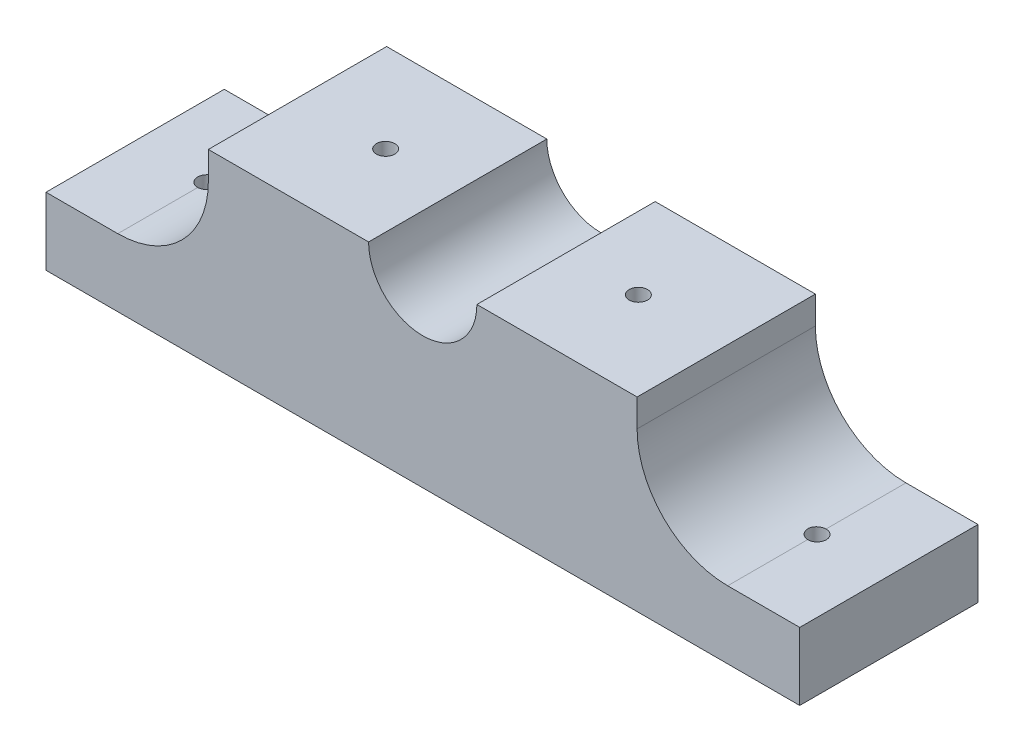
ISO-10303-21;
HEADER;
FILE_DESCRIPTION(('STEP AP214'),'2;1');
FILE_NAME('part.step','',(''),(''),'','','');
FILE_SCHEMA(('AUTOMOTIVE_DESIGN { 1 0 10303 214 1 1 1 1 }'));
ENDSEC;
DATA;
#1=APPLICATION_CONTEXT('core data for automotive mechanical design processes');
#2=APPLICATION_PROTOCOL_DEFINITION('international standard','automotive_design',2000,#1);
#3=PRODUCT_CONTEXT('',#1,'mechanical');
#4=PRODUCT('Part','Part','',(#3));
#5=PRODUCT_RELATED_PRODUCT_CATEGORY('part','',(#4));
#6=PRODUCT_DEFINITION_FORMATION('','',#4);
#7=PRODUCT_DEFINITION_CONTEXT('part definition',#1,'design');
#8=PRODUCT_DEFINITION('design','',#6,#7);
#9=PRODUCT_DEFINITION_SHAPE('','',#8);
#10=(LENGTH_UNIT() NAMED_UNIT(*) SI_UNIT(.MILLI.,.METRE.));
#11=(NAMED_UNIT(*) PLANE_ANGLE_UNIT() SI_UNIT($,.RADIAN.));
#12=(NAMED_UNIT(*) SI_UNIT($,.STERADIAN.) SOLID_ANGLE_UNIT());
#13=UNCERTAINTY_MEASURE_WITH_UNIT(LENGTH_MEASURE(1.E-05),#10,'distance_accuracy_value','');
#14=(GEOMETRIC_REPRESENTATION_CONTEXT(3) GLOBAL_UNCERTAINTY_ASSIGNED_CONTEXT((#13)) GLOBAL_UNIT_ASSIGNED_CONTEXT((#10,
#11,#12)) REPRESENTATION_CONTEXT('',''));
#15=CARTESIAN_POINT('',(0.,0.,0.));
#16=DIRECTION('',(0.,0.,1.));
#17=DIRECTION('',(1.,0.,0.));
#18=AXIS2_PLACEMENT_3D('',#15,#16,#17);
#19=CARTESIAN_POINT('',(16.8821651532389,8.762500128,4.936500033));
#20=DIRECTION('',(0.,0.,1.));
#21=DIRECTION('',(1.,0.,0.));
#22=AXIS2_PLACEMENT_3D('',#19,#20,#21);
#23=CYLINDRICAL_SURFACE('',#22,5.0165);
#24=CARTESIAN_POINT('',(16.8968348527611,3.74602157727182,-0.508000000000002));
#25=CARTESIAN_POINT('',(16.8683835995085,3.74593870795814,-0.507998769979204));
#26=CARTESIAN_POINT('',(16.8399128999517,3.74609973687703,-0.505601778276698));
#27=CARTESIAN_POINT('',(16.783759490476,3.74688654606868,-0.49607527330449));
#28=CARTESIAN_POINT('',(16.7560776786133,3.74751283563572,-0.488940574846726));
#29=CARTESIAN_POINT('',(16.7023233890728,3.74915274800012,-0.470148024369588));
#30=CARTESIAN_POINT('',(16.6762499586369,3.75016613888046,-0.45849288053891));
#31=CARTESIAN_POINT('',(16.6264346056154,3.75246053555959,-0.430995506692803));
#32=CARTESIAN_POINT('',(16.6026922241687,3.75374148853356,-0.415154103007707));
#33=CARTESIAN_POINT('',(16.5581226474811,3.75642686022117,-0.379673404731885));
#34=CARTESIAN_POINT('',(16.5373049258928,3.75783165722054,-0.360022237339966));
#35=CARTESIAN_POINT('',(16.4992567502414,3.76059866589861,-0.317505202576717));
#36=CARTESIAN_POINT('',(16.4820264638949,3.76196087558378,-0.294639184991432));
#37=CARTESIAN_POINT('',(16.4516055167601,3.76448802050699,-0.246277736405523));
#38=CARTESIAN_POINT('',(16.4384241664088,3.76565249835814,-0.220776422758243));
#39=CARTESIAN_POINT('',(16.4165339184629,3.76764464137813,-0.167909174167944));
#40=CARTESIAN_POINT('',(16.4078249154476,3.76847231448592,-0.140543283193378));
#41=CARTESIAN_POINT('',(16.3951534510169,3.76969203392459,-0.0848157170487618));
#42=CARTESIAN_POINT('',(16.3911760109098,3.77008545467971,-0.056457478415006));
#43=CARTESIAN_POINT('',(16.3880343638308,3.77039539767983,0.000526572896369434));
#44=CARTESIAN_POINT('',(16.3888700334707,3.77031193215021,0.0291523786958964));
#45=CARTESIAN_POINT('',(16.3953181438809,3.76967903948762,0.0857521651965404));
#46=CARTESIAN_POINT('',(16.4009136635174,3.76913126299168,0.11372809471511));
#47=CARTESIAN_POINT('',(16.41669634307,3.76763543171349,0.168341868443256));
#48=CARTESIAN_POINT('',(16.4268835650171,3.76668737152369,0.194979694570531));
#49=CARTESIAN_POINT('',(16.4515792774824,3.76449840580836,0.24621459415436));
#50=CARTESIAN_POINT('',(16.466095283286,3.76325699177004,0.270808022550724));
#51=CARTESIAN_POINT('',(16.4990312932673,3.76062520679627,0.317216027502702));
#52=CARTESIAN_POINT('',(16.5174514086494,3.75923483161837,0.339030524875074));
#53=CARTESIAN_POINT('',(16.5577663831488,3.75645910769828,0.379358549415782));
#54=CARTESIAN_POINT('',(16.5796756906958,3.75507380550056,0.39785763927004));
#55=CARTESIAN_POINT('',(16.626297031141,3.75247538707805,0.430917514415933));
#56=CARTESIAN_POINT('',(16.6510090633219,3.7512622708092,0.445478300715511));
#57=CARTESIAN_POINT('',(16.702539324891,3.74915085076711,0.470245034168563));
#58=CARTESIAN_POINT('',(16.72935751907,3.74825254173255,0.480451054103323));
#59=CARTESIAN_POINT('',(16.7843377096661,3.74687876906453,0.496211780426468));
#60=CARTESIAN_POINT('',(16.8124996650633,3.74640329253232,0.501766628701178));
#61=CARTESIAN_POINT('',(16.8692367550418,3.74593693401639,0.508048678622856));
#62=CARTESIAN_POINT('',(16.8978095621675,3.74594395506502,0.508796755312923));
#63=CARTESIAN_POINT('',(16.9546725937421,3.74644356788062,0.505499599644446));
#64=CARTESIAN_POINT('',(16.9829628216772,3.74693615364964,0.501454426494619));
#65=CARTESIAN_POINT('',(17.0384043979041,3.74835717611454,0.48870204839272));
#66=CARTESIAN_POINT('',(17.0655577720878,3.74928479811608,0.480003553472104));
#67=CARTESIAN_POINT('',(17.1180194446348,3.75147877729557,0.458201185757061));
#68=CARTESIAN_POINT('',(17.1433276979362,3.75274514274284,0.445097205414931));
#69=CARTESIAN_POINT('',(17.1914822869587,3.75548707409465,0.414800002874336));
#70=CARTESIAN_POINT('',(17.2143192821744,3.75696338801938,0.397592003363164));
#71=CARTESIAN_POINT('',(17.2567879898025,3.75996236178625,0.359596443166546));
#72=CARTESIAN_POINT('',(17.2764196191261,3.76148502282857,0.338808789718832));
#73=CARTESIAN_POINT('',(17.3119933917473,3.76441643840524,0.294151785084833));
#74=CARTESIAN_POINT('',(17.3279217187912,3.7658247540214,0.270271395326607));
#75=CARTESIAN_POINT('',(17.3555412639642,3.76836551858372,0.220160989199365));
#76=CARTESIAN_POINT('',(17.367232547566,3.76949797179253,0.193931009144987));
#77=CARTESIAN_POINT('',(17.3860199809078,3.77135876377348,0.139920468958283));
#78=CARTESIAN_POINT('',(17.3931255173129,3.77208792760676,0.112143203498635));
#79=CARTESIAN_POINT('',(17.4025707222305,3.77306396713842,0.0557818545515448));
#80=CARTESIAN_POINT('',(17.4049105391815,3.77331085785822,0.0271977962215146));
#81=CARTESIAN_POINT('',(17.4047557911068,3.77329465761081,-0.0298201447762072));
#82=CARTESIAN_POINT('',(17.4022842340411,3.7730339937649,-0.058254093381145));
#83=CARTESIAN_POINT('',(17.3926251681188,3.77203661675151,-0.114300448364218));
#84=CARTESIAN_POINT('',(17.3854376553487,3.77129990318898,-0.141912854060572));
#85=CARTESIAN_POINT('',(17.3665571482628,3.76943233550989,-0.19553196569449));
#86=CARTESIAN_POINT('',(17.3548648511422,3.76830154238672,-0.22153891938192));
#87=CARTESIAN_POINT('',(17.3273091704034,3.76577023243768,-0.271224797228588));
#88=CARTESIAN_POINT('',(17.3114458014165,3.76436971655795,-0.294903729553716));
#89=CARTESIAN_POINT('',(17.2759121792001,3.76144485029233,-0.339379282348455));
#90=CARTESIAN_POINT('',(17.2562247885962,3.75991996107327,-0.360162175840875));
#91=CARTESIAN_POINT('',(17.2136364687143,3.75691787233579,-0.398139205724773));
#92=CARTESIAN_POINT('',(17.1907347663012,3.75544068439635,-0.415332476225729));
#93=CARTESIAN_POINT('',(17.1422963473192,3.752690380373,-0.445681623375823));
#94=CARTESIAN_POINT('',(17.1167523465453,3.75141785453617,-0.4588259191185));
#95=CARTESIAN_POINT('',(17.0638229420305,3.74922062020477,-0.480620765269378));
#96=CARTESIAN_POINT('',(17.0364396486881,3.74829552084712,-0.489276369764739));
#97=CARTESIAN_POINT('',(16.9902243857495,3.74713046252969,-0.499695529107196));
#98=CARTESIAN_POINT('',(16.9716879812062,3.74676430311436,-0.502805386081911));
#99=CARTESIAN_POINT('',(16.9343821583255,3.74623720788274,-0.506958023056359));
#100=CARTESIAN_POINT('',(16.9156127409759,3.74607627119671,-0.508000811816369));
#101=CARTESIAN_POINT('',(16.8968348527611,3.74602157727182,-0.508000000000002));
#102=B_SPLINE_CURVE_WITH_KNOTS('',3,(#24,#25,#26,#27,#28,#29,#30,#31,#32,#33,#34,#35,#36,#37,
#38,#39,#40,#41,#42,#43,#44,#45,#46,#47,#48,#49,#50,#51,#52,#53,#54,#55,#56,#57,#58,#59,#60,#61,
#62,#63,#64,#65,#66,#67,#68,#69,#70,#71,#72,#73,#74,#75,#76,#77,#78,#79,#80,#81,#82,#83,#84,#85,
#86,#87,#88,#89,#90,#91,#92,#93,#94,#95,#96,#97,#98,#99,#100,#101),.UNSPECIFIED.,.T.,.F.,(4,2,2,
2,2,2,2,2,2,2,2,2,2,2,2,2,2,2,2,2,2,2,2,2,2,2,2,2,2,2,2,2,2,2,2,2,2,2,4),(0.,0.0852855718549176,
0.170664638774131,0.255992634099702,0.341303799005254,0.426885231311988,0.512470663743069,
0.59825144960307,0.68403021337261,0.769536698790279,0.855040992186797,0.940242584440914,
1.02544532774718,1.11079686300209,1.19615082973159,1.28186789763181,1.36758494359418,
1.45330055690996,1.53901355533268,1.62435406283229,1.70969351617251,1.7948737882209,
1.8800561398603,1.96554996503408,2.05104600600722,2.13685607221388,2.22266481239192,
2.3082973469985,2.39392721435517,2.47914860596874,2.56437006830381,2.64957834640188,
2.73478632560828,2.82038536258805,2.90600502401143,2.99186734902295,3.07763278542165,
3.13392168445753,3.19021034493943),.UNSPECIFIED.);
#103=CARTESIAN_POINT('',(16.8821651532389,3.746000128,-0.507788144717784));
#104=VERTEX_POINT('',#103);
#105=CARTESIAN_POINT('',(16.8821651532389,3.74600012799998,0.507788144717992));
#106=VERTEX_POINT('',#105);
#107=EDGE_CURVE('E11',#104,#106,#102,.T.);
#108=ORIENTED_EDGE('',*,*,#107,.F.);
#109=DIRECTION('',(0.,0.,-1.));
#110=VECTOR('',#109,1.);
#111=CARTESIAN_POINT('',(16.8821651532389,3.746000128,4.936500033));
#112=LINE('',#111,#110);
#113=CARTESIAN_POINT('',(16.8821651532389,3.746000128,-4.936500033));
#114=VERTEX_POINT('',#113);
#115=EDGE_CURVE('E173',#114,#104,#112,.F.);
#116=ORIENTED_EDGE('',*,*,#115,.F.);
#117=CARTESIAN_POINT('',(16.8821651532389,8.762500128,-4.936500033));
#118=DIRECTION('',(0.,0.,-1.));
#119=DIRECTION('',(-1.,0.,0.));
#120=AXIS2_PLACEMENT_3D('',#117,#118,#119);
#121=CIRCLE('',#120,5.0165);
#122=CARTESIAN_POINT('',(11.8656651532389,8.762500128,-4.936500033));
#123=VERTEX_POINT('',#122);
#124=EDGE_CURVE('E171',#123,#114,#121,.F.);
#125=ORIENTED_EDGE('',*,*,#124,.F.);
#126=DIRECTION('',(0.,0.,-1.));
#127=VECTOR('',#126,1.);
#128=CARTESIAN_POINT('',(11.8656651532389,8.762500128,-4.936500033));
#129=LINE('',#128,#127);
#130=CARTESIAN_POINT('',(11.8656651532389,8.762500128,4.936500033));
#131=VERTEX_POINT('',#130);
#132=EDGE_CURVE('E267',#131,#123,#129,.T.);
#133=ORIENTED_EDGE('',*,*,#132,.F.);
#134=CARTESIAN_POINT('',(16.8821651532389,8.762500128,4.936500033));
#135=DIRECTION('',(0.,0.,-1.));
#136=DIRECTION('',(-1.,0.,0.));
#137=AXIS2_PLACEMENT_3D('',#134,#135,#136);
#138=CIRCLE('',#137,5.0165);
#139=CARTESIAN_POINT('',(16.8821651532389,3.746000128,4.936500033));
#140=VERTEX_POINT('',#139);
#141=EDGE_CURVE('E179',#140,#131,#138,.T.);
#142=ORIENTED_EDGE('',*,*,#141,.F.);
#143=EDGE_CURVE('E261',#106,#140,#112,.F.);
#144=ORIENTED_EDGE('',*,*,#143,.F.);
#145=EDGE_LOOP('',(#108,#116,#125,#133,#142,#144));
#146=FACE_BOUND('',#145,.T.);
#147=ADVANCED_FACE('F43',(#146),#23,.F.);
#148=CARTESIAN_POINT('',(-16.8968348527611,8.762500128,-4.936500033));
#149=DIRECTION('',(0.,0.,-1.));
#150=DIRECTION('',(-1.,0.,0.));
#151=AXIS2_PLACEMENT_3D('',#148,#149,#150);
#152=CYLINDRICAL_SURFACE('',#151,5.0165);
#153=CARTESIAN_POINT('',(-16.8968348527611,3.746000128,-0.508000000000002));
#154=CARTESIAN_POINT('',(-16.9252912577513,3.74600045924647,-0.507998768677202));
#155=CARTESIAN_POINT('',(-16.9537664299434,3.74624483120748,-0.505600905057684));
#156=CARTESIAN_POINT('',(-17.0099271988971,3.74719618056567,-0.496071630417038));
#157=CARTESIAN_POINT('',(-17.037611892907,3.74790366640504,-0.488935016706088));
#158=CARTESIAN_POINT('',(-17.0913703203312,3.74970138833436,-0.470138245795765));
#159=CARTESIAN_POINT('',(-17.1174450206511,3.75079139201591,-0.458480834870374));
#160=CARTESIAN_POINT('',(-17.167262014606,3.75323229777704,-0.430978743061325));
#161=CARTESIAN_POINT('',(-17.1910047678685,3.75458314828732,-0.415134889607921));
#162=CARTESIAN_POINT('',(-17.2355770550448,3.75740001681339,-0.37964700501901));
#163=CARTESIAN_POINT('',(-17.2563967867362,3.75886639774871,-0.359990690078664));
#164=CARTESIAN_POINT('',(-17.2944477786642,3.76174605926462,-0.317462062201704));
#165=CARTESIAN_POINT('',(-17.3116788721932,3.76315933737586,-0.294589599943879));
#166=CARTESIAN_POINT('',(-17.342098257504,3.76577648186433,-0.246216485962239));
#167=CARTESIAN_POINT('',(-17.3552776649278,3.76697988557492,-0.220710220139896));
#168=CARTESIAN_POINT('',(-17.377162832769,3.76903651816332,-0.167832441304631));
#169=CARTESIAN_POINT('',(-17.3858687063635,3.76988975589996,-0.140460975499715));
#170=CARTESIAN_POINT('',(-17.3985305862197,3.77114616308163,-0.0847298215469618));
#171=CARTESIAN_POINT('',(-17.4025028633075,3.77155087391374,-0.0563738653941626));
#172=CARTESIAN_POINT('',(-17.4056350902244,3.77186918777975,0.000604933340367476));
#173=CARTESIAN_POINT('',(-17.4047951695653,3.77178280403059,0.0292277687188252));
#174=CARTESIAN_POINT('',(-17.3983402517494,3.77113009656819,0.0858156126329079));
#175=CARTESIAN_POINT('',(-17.3927430272856,3.77056555920443,0.113782671984075));
#176=CARTESIAN_POINT('',(-17.3769600438231,3.76902294412025,0.168378397731428));
#177=CARTESIAN_POINT('',(-17.3667742214186,3.76804486068542,0.19500704562762));
#178=CARTESIAN_POINT('',(-17.3420835860418,3.7657833051265,0.246226158981847));
#179=CARTESIAN_POINT('',(-17.32757089529,3.76449927684299,0.270812801330096));
#180=CARTESIAN_POINT('',(-17.2946441449445,3.76177097835335,0.31720814075412));
#181=CARTESIAN_POINT('',(-17.2762299682395,3.76032670333771,0.339016754410028));
#182=CARTESIAN_POINT('',(-17.2359237268813,3.75743268635884,0.379340241064464));
#183=CARTESIAN_POINT('',(-17.2140163146437,3.75598294920071,0.397839776853945));
#184=CARTESIAN_POINT('',(-17.1673987458816,3.75324752120446,0.430901073878296));
#185=CARTESIAN_POINT('',(-17.1426885860919,3.75196183055744,0.445462830525777));
#186=CARTESIAN_POINT('',(-17.0911562723399,3.74969892034249,0.470234627576738));
#187=CARTESIAN_POINT('',(-17.0643337377377,3.74872175652925,0.480443881544616));
#188=CARTESIAN_POINT('',(-17.0093431146977,3.74718656660775,0.49620958703117));
#189=CARTESIAN_POINT('',(-16.9811750675542,3.74662852764514,0.501766181245193));
#190=CARTESIAN_POINT('',(-16.9244258184778,3.74599611597428,0.508049359609694));
#191=CARTESIAN_POINT('',(-16.8958469822616,3.74591962412605,0.508797106325283));
#192=CARTESIAN_POINT('',(-16.8389707967262,3.74625324121554,0.505496958896286));
#193=CARTESIAN_POINT('',(-16.8106734435108,3.74666334340889,0.50144913122006));
#194=CARTESIAN_POINT('',(-16.7552246251585,3.74792270963552,0.488690295793221));
#195=CARTESIAN_POINT('',(-16.7280708550906,3.74877103958714,0.47998920507881));
#196=CARTESIAN_POINT('',(-16.6756083311303,3.75081169916914,0.458181032595188));
#197=CARTESIAN_POINT('',(-16.6502996196161,3.75200403669775,0.445073849663335));
#198=CARTESIAN_POINT('',(-16.6021500045633,3.75460464000241,0.414773132710691));
#199=CARTESIAN_POINT('',(-16.5793178847363,3.75601363406563,0.397565704372459));
#200=CARTESIAN_POINT('',(-16.5368585067002,3.75888713142632,0.359572862450721));
#201=CARTESIAN_POINT('',(-16.5172313310419,3.7603516361524,0.33878735673382));
#202=CARTESIAN_POINT('',(-16.4816654327206,3.76317747894474,0.294136005005906));
#203=CARTESIAN_POINT('',(-16.4657406054803,3.76453841585634,0.27025906197722));
#204=CARTESIAN_POINT('',(-16.4381269964831,3.76699691463327,0.220157308572724));
#205=CARTESIAN_POINT('',(-16.426438155526,3.7680944801793,0.193932531015582));
#206=CARTESIAN_POINT('',(-16.4076515499143,3.76989945653499,0.139927059505935));
#207=CARTESIAN_POINT('',(-16.400545537197,3.7706075679346,0.112149259152284));
#208=CARTESIAN_POINT('',(-16.3910995485465,3.7715556332561,0.0557872209832206));
#209=CARTESIAN_POINT('',(-16.388759432125,3.77179560097784,0.0272030069643103));
#210=CARTESIAN_POINT('',(-16.3889136417523,3.7717799147876,-0.0298223405419571));
#211=CARTESIAN_POINT('',(-16.3913861398721,3.77152649864921,-0.05826353618926));
#212=CARTESIAN_POINT('',(-16.4010496059138,3.77055737188898,-0.114324290353424));
#213=CARTESIAN_POINT('',(-16.4082405789626,3.76984166076482,-0.141943847977489));
#214=CARTESIAN_POINT('',(-16.4271308097882,3.76802921105965,-0.19557701964315));
#215=CARTESIAN_POINT('',(-16.4388294080371,3.76693252822237,-0.221590867976497));
#216=CARTESIAN_POINT('',(-16.4664005635714,3.76448159263757,-0.271289278918488));
#217=CARTESIAN_POINT('',(-16.4822731009646,3.76312734111759,-0.294973852627332));
#218=CARTESIAN_POINT('',(-16.5178235071837,3.76030650069672,-0.339453254799866));
#219=CARTESIAN_POINT('',(-16.5375176433438,3.75883944835673,-0.36023505246726));
#220=CARTESIAN_POINT('',(-16.5801198956723,3.75596253241433,-0.398208425876238));
#221=CARTESIAN_POINT('',(-16.603028779964,3.75455268258382,-0.415399141123994));
#222=CARTESIAN_POINT('',(-16.6514749158376,3.75194523945232,-0.445737329437169));
#223=CARTESIAN_POINT('',(-16.6770187817199,3.75074820189873,-0.458874280205596));
#224=CARTESIAN_POINT('',(-16.7299457564553,3.74870727487628,-0.480654919211197));
#225=CARTESIAN_POINT('',(-16.7573267555083,3.74786298809313,-0.489303665327665));
#226=CARTESIAN_POINT('',(-16.8035242883721,3.74683444427723,-0.499709706116581));
#227=CARTESIAN_POINT('',(-16.8220456747458,3.74652303756371,-0.502814308693915));
#228=CARTESIAN_POINT('',(-16.8593202730865,3.7461057706667,-0.506959857151473));
#229=CARTESIAN_POINT('',(-16.8780734840666,3.74599990960849,-0.508000811813758));
#230=CARTESIAN_POINT('',(-16.8968348527611,3.746000128,-0.508000000000002));
#231=B_SPLINE_CURVE_WITH_KNOTS('',3,(#153,#154,#155,#156,#157,#158,#159,#160,#161,#162,#163,
#164,#165,#166,#167,#168,#169,#170,#171,#172,#173,#174,#175,#176,#177,#178,#179,#180,#181,#182,
#183,#184,#185,#186,#187,#188,#189,#190,#191,#192,#193,#194,#195,#196,#197,#198,#199,#200,#201,
#202,#203,#204,#205,#206,#207,#208,#209,#210,#211,#212,#213,#214,#215,#216,#217,#218,#219,#220,
#221,#222,#223,#224,#225,#226,#227,#228,#229,#230),.UNSPECIFIED.,.T.,.F.,(4,2,2,2,2,2,2,2,2,2,2,
2,2,2,2,2,2,2,2,2,2,2,2,2,2,2,2,2,2,2,2,2,2,2,2,2,2,2,4),(0.,0.0853007045760408,
0.170695216277657,0.256037933952439,0.341363796649671,0.426969289867916,0.512578758942368,
0.598374631323897,0.684168333027328,0.769666276862611,0.855161919685305,0.940339558317594,
1.02551837398145,1.1108532287746,1.19619064543658,1.28191388360033,1.36763722162851,
1.45337604209223,1.5391122328818,1.62447085991922,1.70982830386966,1.79500455474215,
1.88018276137106,1.96565381850228,2.05112707679243,2.13691612797069,2.22270398015345,
2.30833699935951,2.39396749425407,2.47921051129827,2.56445362096469,2.6496842631191,
2.73491449908569,2.82051582335791,2.90613763591844,2.99197986171491,3.07772513835249,
3.13396431471839,3.19020325175234),.UNSPECIFIED.);
#232=CARTESIAN_POINT('',(-16.8968348527611,3.746000128,0.508000000000002));
#233=VERTEX_POINT('',#232);
#234=CARTESIAN_POINT('',(-16.8968348527611,3.746000128,-0.508000000000002));
#235=VERTEX_POINT('',#234);
#236=EDGE_CURVE('E57',#233,#235,#231,.T.);
#237=ORIENTED_EDGE('',*,*,#236,.F.);
#238=DIRECTION('',(0.,0.,1.));
#239=VECTOR('',#238,1.);
#240=CARTESIAN_POINT('',(-16.8968348527611,3.746000128,-4.936500033));
#241=LINE('',#240,#239);
#242=CARTESIAN_POINT('',(-16.8968348527611,3.746000128,4.936500033));
#243=VERTEX_POINT('',#242);
#244=EDGE_CURVE('E159',#243,#233,#241,.F.);
#245=ORIENTED_EDGE('',*,*,#244,.F.);
#246=CARTESIAN_POINT('',(-16.8968348527611,8.762500128,4.936500033));
#247=DIRECTION('',(0.,0.,-1.));
#248=DIRECTION('',(-1.,0.,0.));
#249=AXIS2_PLACEMENT_3D('',#246,#247,#248);
#250=CIRCLE('',#249,5.0165);
#251=CARTESIAN_POINT('',(-11.8803348527611,8.762500128,4.936500033));
#252=VERTEX_POINT('',#251);
#253=EDGE_CURVE('E182',#252,#243,#250,.T.);
#254=ORIENTED_EDGE('',*,*,#253,.F.);
#255=DIRECTION('',(0.,0.,1.));
#256=VECTOR('',#255,1.);
#257=CARTESIAN_POINT('',(-11.8803348527611,8.762500128,4.936500033));
#258=LINE('',#257,#256);
#259=CARTESIAN_POINT('',(-11.8803348527611,8.762500128,-4.936500033));
#260=VERTEX_POINT('',#259);
#261=EDGE_CURVE('E167',#260,#252,#258,.T.);
#262=ORIENTED_EDGE('',*,*,#261,.F.);
#263=CARTESIAN_POINT('',(-16.8968348527611,8.762500128,-4.936500033));
#264=DIRECTION('',(0.,0.,-1.));
#265=DIRECTION('',(-1.,0.,0.));
#266=AXIS2_PLACEMENT_3D('',#263,#264,#265);
#267=CIRCLE('',#266,5.0165);
#268=CARTESIAN_POINT('',(-16.8968348527611,3.746000128,-4.936500033));
#269=VERTEX_POINT('',#268);
#270=EDGE_CURVE('E165',#269,#260,#267,.F.);
#271=ORIENTED_EDGE('',*,*,#270,.F.);
#272=EDGE_CURVE('E156',#235,#269,#241,.F.);
#273=ORIENTED_EDGE('',*,*,#272,.F.);
#274=EDGE_LOOP('',(#237,#245,#254,#262,#271,#273));
#275=FACE_BOUND('',#274,.T.);
#276=ADVANCED_FACE('F45',(#275),#152,.F.);
#277=CARTESIAN_POINT('',(0.,10.294500112,0.));
#278=DIRECTION('',(0.,1.,0.));
#279=DIRECTION('',(0.,0.,1.));
#280=AXIS2_PLACEMENT_3D('',#277,#278,#279);
#281=PLANE('',#280);
#282=CARTESIAN_POINT('',(-6.99999997,10.294500112,0.));
#283=DIRECTION('',(0.,1.,0.));
#284=DIRECTION('',(0.,0.,1.));
#285=AXIS2_PLACEMENT_3D('',#282,#283,#284);
#286=CIRCLE('',#285,0.508);
#287=CARTESIAN_POINT('',(-6.99999997,10.294500112,0.508000000000001));
#288=VERTEX_POINT('',#287);
#289=EDGE_CURVE('E371',#288,#288,#286,.T.);
#290=ORIENTED_EDGE('',*,*,#289,.F.);
#291=EDGE_LOOP('',(#290));
#292=FACE_BOUND('',#291,.T.);
#293=DIRECTION('',(0.,0.,1.));
#294=VECTOR('',#293,1.);
#295=CARTESIAN_POINT('',(-3.00707484976112,10.294500112,-4.936500033));
#296=LINE('',#295,#294);
#297=CARTESIAN_POINT('',(-3.00707484976112,10.294500112,-4.936500033));
#298=VERTEX_POINT('',#297);
#299=CARTESIAN_POINT('',(-3.00707484976112,10.294500112,4.936500033));
#300=VERTEX_POINT('',#299);
#301=EDGE_CURVE('E152',#298,#300,#296,.T.);
#302=ORIENTED_EDGE('',*,*,#301,.F.);
#303=DIRECTION('',(-1.,0.,0.));
#304=VECTOR('',#303,1.);
#305=CARTESIAN_POINT('',(-11.8803348527611,10.294500112,-4.936500033));
#306=LINE('',#305,#304);
#307=CARTESIAN_POINT('',(-11.8803348527611,10.294500112,-4.936500033));
#308=VERTEX_POINT('',#307);
#309=EDGE_CURVE('E345',#298,#308,#306,.T.);
#310=ORIENTED_EDGE('',*,*,#309,.T.);
#311=DIRECTION('',(0.,0.,1.));
#312=VECTOR('',#311,1.);
#313=CARTESIAN_POINT('',(-11.8803348527611,10.294500112,-4.936500033));
#314=LINE('',#313,#312);
#315=CARTESIAN_POINT('',(-11.8803348527611,10.294500112,4.936500033));
#316=VERTEX_POINT('',#315);
#317=EDGE_CURVE('E338',#308,#316,#314,.T.);
#318=ORIENTED_EDGE('',*,*,#317,.T.);
#319=DIRECTION('',(1.,0.,0.));
#320=VECTOR('',#319,1.);
#321=CARTESIAN_POINT('',(-11.8803348527611,10.294500112,4.936500033));
#322=LINE('',#321,#320);
#323=EDGE_CURVE('E333',#316,#300,#322,.T.);
#324=ORIENTED_EDGE('',*,*,#323,.T.);
#325=EDGE_LOOP('',(#302,#310,#318,#324));
#326=FACE_BOUND('',#325,.T.);
#327=ADVANCED_FACE('F220',(#292,#326),#281,.T.);
#328=CARTESIAN_POINT('',(0.,3.746000128,0.));
#329=DIRECTION('',(0.,-1.,0.));
#330=DIRECTION('',(0.,0.,-1.));
#331=AXIS2_PLACEMENT_3D('',#328,#329,#330);
#332=PLANE('',#331);
#333=CARTESIAN_POINT('',(16.8968348527611,3.746000128,0.));
#334=DIRECTION('',(0.,-1.,0.));
#335=DIRECTION('',(0.,0.,-1.));
#336=AXIS2_PLACEMENT_3D('',#333,#334,#335);
#337=CIRCLE('',#336,0.508000000000002);
#338=EDGE_CURVE('E62',#106,#104,#337,.F.);
#339=ORIENTED_EDGE('',*,*,#338,.F.);
#340=ORIENTED_EDGE('',*,*,#143,.T.);
#341=DIRECTION('',(1.,0.,0.));
#342=VECTOR('',#341,1.);
#343=CARTESIAN_POINT('',(-20.873000037,3.746000128,4.936500033));
#344=LINE('',#343,#342);
#345=CARTESIAN_POINT('',(20.873000037,3.746000128,4.936500033));
#346=VERTEX_POINT('',#345);
#347=EDGE_CURVE('E305',#140,#346,#344,.T.);
#348=ORIENTED_EDGE('',*,*,#347,.T.);
#349=DIRECTION('',(0.,0.,-1.));
#350=VECTOR('',#349,1.);
#351=CARTESIAN_POINT('',(20.873000037,3.746000128,4.936500033));
#352=LINE('',#351,#350);
#353=CARTESIAN_POINT('',(20.873000037,3.746000128,-4.936500033));
#354=VERTEX_POINT('',#353);
#355=EDGE_CURVE('E306',#346,#354,#352,.T.);
#356=ORIENTED_EDGE('',*,*,#355,.T.);
#357=DIRECTION('',(1.,0.,0.));
#358=VECTOR('',#357,1.);
#359=CARTESIAN_POINT('',(-20.873000037,3.746000128,-4.936500033));
#360=LINE('',#359,#358);
#361=EDGE_CURVE('E264',#114,#354,#360,.T.);
#362=ORIENTED_EDGE('',*,*,#361,.F.);
#363=ORIENTED_EDGE('',*,*,#115,.T.);
#364=EDGE_LOOP('',(#339,#340,#348,#356,#362,#363));
#365=FACE_BOUND('',#364,.T.);
#366=ADVANCED_FACE('F229',(#365),#332,.F.);
#367=CARTESIAN_POINT('',(-16.8968348527611,3.746000128,0.));
#368=DIRECTION('',(0.,-1.,0.));
#369=DIRECTION('',(0.,0.,-1.));
#370=AXIS2_PLACEMENT_3D('',#367,#368,#369);
#371=CIRCLE('',#370,0.508000000000002);
#372=EDGE_CURVE('E69',#235,#233,#371,.F.);
#373=ORIENTED_EDGE('',*,*,#372,.F.);
#374=ORIENTED_EDGE('',*,*,#272,.T.);
#375=CARTESIAN_POINT('',(-20.873000037,3.746000128,-4.936500033));
#376=VERTEX_POINT('',#375);
#377=EDGE_CURVE('E309',#376,#269,#360,.T.);
#378=ORIENTED_EDGE('',*,*,#377,.F.);
#379=DIRECTION('',(0.,0.,-1.));
#380=VECTOR('',#379,1.);
#381=CARTESIAN_POINT('',(-20.873000037,3.746000128,4.936500033));
#382=LINE('',#381,#380);
#383=CARTESIAN_POINT('',(-20.873000037,3.746000128,4.936500033));
#384=VERTEX_POINT('',#383);
#385=EDGE_CURVE('E289',#384,#376,#382,.T.);
#386=ORIENTED_EDGE('',*,*,#385,.F.);
#387=EDGE_CURVE('E277',#384,#243,#344,.T.);
#388=ORIENTED_EDGE('',*,*,#387,.T.);
#389=ORIENTED_EDGE('',*,*,#244,.T.);
#390=EDGE_LOOP('',(#373,#374,#378,#386,#388,#389));
#391=FACE_BOUND('',#390,.T.);
#392=ADVANCED_FACE('F154',(#391),#332,.F.);
#393=CARTESIAN_POINT('',(-20.873000037,3.746000128,4.936500033));
#394=DIRECTION('',(-1.,0.,0.));
#395=DIRECTION('',(0.,0.,1.));
#396=AXIS2_PLACEMENT_3D('',#393,#394,#395);
#397=PLANE('',#396);
#398=DIRECTION('',(0.,0.,-1.));
#399=VECTOR('',#398,1.);
#400=CARTESIAN_POINT('',(-20.873000037,0.,4.936500033));
#401=LINE('',#400,#399);
#402=CARTESIAN_POINT('',(-20.873000037,0.,4.936500033));
#403=VERTEX_POINT('',#402);
#404=CARTESIAN_POINT('',(-20.873000037,0.,-4.936500033));
#405=VERTEX_POINT('',#404);
#406=EDGE_CURVE('E298',#403,#405,#401,.T.);
#407=ORIENTED_EDGE('',*,*,#406,.F.);
#408=DIRECTION('',(0.,-1.,0.));
#409=VECTOR('',#408,1.);
#410=CARTESIAN_POINT('',(-20.873000037,3.746000128,4.936500033));
#411=LINE('',#410,#409);
#412=EDGE_CURVE('E272',#384,#403,#411,.T.);
#413=ORIENTED_EDGE('',*,*,#412,.F.);
#414=ORIENTED_EDGE('',*,*,#385,.T.);
#415=DIRECTION('',(0.,-1.,0.));
#416=VECTOR('',#415,1.);
#417=CARTESIAN_POINT('',(-20.873000037,3.746000128,-4.936500033));
#418=LINE('',#417,#416);
#419=EDGE_CURVE('E273',#376,#405,#418,.T.);
#420=ORIENTED_EDGE('',*,*,#419,.T.);
#421=EDGE_LOOP('',(#407,#413,#414,#420));
#422=FACE_BOUND('',#421,.T.);
#423=ADVANCED_FACE('F241',(#422),#397,.T.);
#424=CARTESIAN_POINT('',(-20.873000037,3.746000128,4.936500033));
#425=DIRECTION('',(0.,0.,-1.));
#426=DIRECTION('',(-1.,0.,0.));
#427=AXIS2_PLACEMENT_3D('',#424,#425,#426);
#428=PLANE('',#427);
#429=CARTESIAN_POINT('',(2.99240515023888,10.294500112,4.936500033));
#430=VERTEX_POINT('',#429);
#431=CARTESIAN_POINT('',(11.8656651532389,10.294500112,4.936500033));
#432=VERTEX_POINT('',#431);
#433=EDGE_CURVE('E337',#430,#432,#322,.T.);
#434=ORIENTED_EDGE('',*,*,#433,.F.);
#435=CARTESIAN_POINT('',(-0.00733484976111684,10.294500112,4.936500033));
#436=DIRECTION('',(0.,0.,1.));
#437=DIRECTION('',(1.,0.,0.));
#438=AXIS2_PLACEMENT_3D('',#435,#436,#437);
#439=CIRCLE('',#438,2.99974);
#440=EDGE_CURVE('E346',#300,#430,#439,.T.);
#441=ORIENTED_EDGE('',*,*,#440,.F.);
#442=ORIENTED_EDGE('',*,*,#323,.F.);
#443=DIRECTION('',(0.,-1.,0.));
#444=VECTOR('',#443,1.);
#445=CARTESIAN_POINT('',(-11.8803348527611,10.294500112,4.936500033));
#446=LINE('',#445,#444);
#447=EDGE_CURVE('E318',#316,#252,#446,.T.);
#448=ORIENTED_EDGE('',*,*,#447,.T.);
#449=ORIENTED_EDGE('',*,*,#253,.T.);
#450=ORIENTED_EDGE('',*,*,#387,.F.);
#451=ORIENTED_EDGE('',*,*,#412,.T.);
#452=DIRECTION('',(1.,0.,0.));
#453=VECTOR('',#452,1.);
#454=CARTESIAN_POINT('',(-20.873000037,0.,4.936500033));
#455=LINE('',#454,#453);
#456=CARTESIAN_POINT('',(20.873000037,0.,4.936500033));
#457=VERTEX_POINT('',#456);
#458=EDGE_CURVE('E286',#403,#457,#455,.T.);
#459=ORIENTED_EDGE('',*,*,#458,.T.);
#460=DIRECTION('',(0.,-1.,0.));
#461=VECTOR('',#460,1.);
#462=CARTESIAN_POINT('',(20.873000037,3.746000128,4.936500033));
#463=LINE('',#462,#461);
#464=EDGE_CURVE('E280',#346,#457,#463,.T.);
#465=ORIENTED_EDGE('',*,*,#464,.F.);
#466=ORIENTED_EDGE('',*,*,#347,.F.);
#467=ORIENTED_EDGE('',*,*,#141,.T.);
#468=DIRECTION('',(0.,-1.,0.));
#469=VECTOR('',#468,1.);
#470=CARTESIAN_POINT('',(11.8656651532389,10.294500112,4.936500033));
#471=LINE('',#470,#469);
#472=EDGE_CURVE('E322',#432,#131,#471,.T.);
#473=ORIENTED_EDGE('',*,*,#472,.F.);
#474=EDGE_LOOP('',(#434,#441,#442,#448,#449,#450,#451,#459,#465,#466,#467,#473));
#475=FACE_BOUND('',#474,.T.);
#476=ADVANCED_FACE('F237',(#475),#428,.F.);
#477=CARTESIAN_POINT('',(20.873000037,3.746000128,4.936500033));
#478=DIRECTION('',(-1.,0.,0.));
#479=DIRECTION('',(0.,0.,1.));
#480=AXIS2_PLACEMENT_3D('',#477,#478,#479);
#481=PLANE('',#480);
#482=DIRECTION('',(0.,0.,-1.));
#483=VECTOR('',#482,1.);
#484=CARTESIAN_POINT('',(20.873000037,0.,4.936500033));
#485=LINE('',#484,#483);
#486=CARTESIAN_POINT('',(20.873000037,0.,-4.936500033));
#487=VERTEX_POINT('',#486);
#488=EDGE_CURVE('E290',#457,#487,#485,.T.);
#489=ORIENTED_EDGE('',*,*,#488,.T.);
#490=DIRECTION('',(0.,-1.,0.));
#491=VECTOR('',#490,1.);
#492=CARTESIAN_POINT('',(20.873000037,3.746000128,-4.936500033));
#493=LINE('',#492,#491);
#494=EDGE_CURVE('E276',#354,#487,#493,.T.);
#495=ORIENTED_EDGE('',*,*,#494,.F.);
#496=ORIENTED_EDGE('',*,*,#355,.F.);
#497=ORIENTED_EDGE('',*,*,#464,.T.);
#498=EDGE_LOOP('',(#489,#495,#496,#497));
#499=FACE_BOUND('',#498,.T.);
#500=ADVANCED_FACE('F240',(#499),#481,.F.);
#501=CARTESIAN_POINT('',(-20.873000037,3.746000128,-4.936500033));
#502=DIRECTION('',(0.,0.,-1.));
#503=DIRECTION('',(-1.,0.,0.));
#504=AXIS2_PLACEMENT_3D('',#501,#502,#503);
#505=PLANE('',#504);
#506=CARTESIAN_POINT('',(-0.00733484976111684,10.294500112,-4.936500033));
#507=DIRECTION('',(0.,0.,1.));
#508=DIRECTION('',(1.,0.,0.));
#509=AXIS2_PLACEMENT_3D('',#506,#507,#508);
#510=CIRCLE('',#509,2.99974);
#511=CARTESIAN_POINT('',(2.99240515023888,10.294500112,-4.936500033));
#512=VERTEX_POINT('',#511);
#513=EDGE_CURVE('E349',#298,#512,#510,.T.);
#514=ORIENTED_EDGE('',*,*,#513,.T.);
#515=CARTESIAN_POINT('',(11.8656651532389,10.294500112,-4.936500033));
#516=VERTEX_POINT('',#515);
#517=EDGE_CURVE('E341',#516,#512,#306,.T.);
#518=ORIENTED_EDGE('',*,*,#517,.F.);
#519=DIRECTION('',(0.,-1.,0.));
#520=VECTOR('',#519,1.);
#521=CARTESIAN_POINT('',(11.8656651532389,10.294500112,-4.936500033));
#522=LINE('',#521,#520);
#523=EDGE_CURVE('E326',#516,#123,#522,.T.);
#524=ORIENTED_EDGE('',*,*,#523,.T.);
#525=ORIENTED_EDGE('',*,*,#124,.T.);
#526=ORIENTED_EDGE('',*,*,#361,.T.);
#527=ORIENTED_EDGE('',*,*,#494,.T.);
#528=DIRECTION('',(1.,0.,0.));
#529=VECTOR('',#528,1.);
#530=CARTESIAN_POINT('',(-20.873000037,0.,-4.936500033));
#531=LINE('',#530,#529);
#532=EDGE_CURVE('E294',#405,#487,#531,.T.);
#533=ORIENTED_EDGE('',*,*,#532,.F.);
#534=ORIENTED_EDGE('',*,*,#419,.F.);
#535=ORIENTED_EDGE('',*,*,#377,.T.);
#536=ORIENTED_EDGE('',*,*,#270,.T.);
#537=DIRECTION('',(0.,-1.,0.));
#538=VECTOR('',#537,1.);
#539=CARTESIAN_POINT('',(-11.8803348527611,10.294500112,-4.936500033));
#540=LINE('',#539,#538);
#541=EDGE_CURVE('E302',#308,#260,#540,.T.);
#542=ORIENTED_EDGE('',*,*,#541,.F.);
#543=ORIENTED_EDGE('',*,*,#309,.F.);
#544=EDGE_LOOP('',(#514,#518,#524,#525,#526,#527,#533,#534,#535,#536,#542,#543));
#545=FACE_BOUND('',#544,.T.);
#546=ADVANCED_FACE('F235',(#545),#505,.T.);
#547=CARTESIAN_POINT('',(0.,0.,0.));
#548=DIRECTION('',(0.,-1.,0.));
#549=DIRECTION('',(0.,0.,-1.));
#550=AXIS2_PLACEMENT_3D('',#547,#548,#549);
#551=PLANE('',#550);
#552=ORIENTED_EDGE('',*,*,#406,.T.);
#553=ORIENTED_EDGE('',*,*,#532,.T.);
#554=ORIENTED_EDGE('',*,*,#488,.F.);
#555=ORIENTED_EDGE('',*,*,#458,.F.);
#556=EDGE_LOOP('',(#552,#553,#554,#555));
#557=FACE_BOUND('',#556,.T.);
#558=ADVANCED_FACE('F227',(#557),#551,.T.);
#559=CARTESIAN_POINT('',(-11.8803348527611,10.294500112,-4.936500033));
#560=DIRECTION('',(1.,0.,0.));
#561=DIRECTION('',(0.,0.,-1.));
#562=AXIS2_PLACEMENT_3D('',#559,#560,#561);
#563=PLANE('',#562);
#564=ORIENTED_EDGE('',*,*,#541,.T.);
#565=ORIENTED_EDGE('',*,*,#261,.T.);
#566=ORIENTED_EDGE('',*,*,#447,.F.);
#567=ORIENTED_EDGE('',*,*,#317,.F.);
#568=EDGE_LOOP('',(#564,#565,#566,#567));
#569=FACE_BOUND('',#568,.T.);
#570=ADVANCED_FACE('F223',(#569),#563,.F.);
#571=CARTESIAN_POINT('',(11.8656651532389,10.294500112,4.936500033));
#572=DIRECTION('',(-1.,0.,0.));
#573=DIRECTION('',(0.,0.,1.));
#574=AXIS2_PLACEMENT_3D('',#571,#572,#573);
#575=PLANE('',#574);
#576=ORIENTED_EDGE('',*,*,#472,.T.);
#577=ORIENTED_EDGE('',*,*,#132,.T.);
#578=ORIENTED_EDGE('',*,*,#523,.F.);
#579=DIRECTION('',(0.,0.,-1.));
#580=VECTOR('',#579,1.);
#581=CARTESIAN_POINT('',(11.8656651532389,10.294500112,4.936500033));
#582=LINE('',#581,#580);
#583=EDGE_CURVE('E330',#432,#516,#582,.T.);
#584=ORIENTED_EDGE('',*,*,#583,.F.);
#585=EDGE_LOOP('',(#576,#577,#578,#584));
#586=FACE_BOUND('',#585,.T.);
#587=ADVANCED_FACE('F218',(#586),#575,.F.);
#588=CARTESIAN_POINT('',(6.99999997,10.294500112,0.));
#589=DIRECTION('',(0.,1.,0.));
#590=DIRECTION('',(0.,0.,-1.));
#591=AXIS2_PLACEMENT_3D('',#588,#589,#590);
#592=CIRCLE('',#591,0.508);
#593=CARTESIAN_POINT('',(6.99999997,10.294500112,-0.507999999999999));
#594=VERTEX_POINT('',#593);
#595=EDGE_CURVE('E367',#594,#594,#592,.T.);
#596=ORIENTED_EDGE('',*,*,#595,.F.);
#597=EDGE_LOOP('',(#596));
#598=FACE_BOUND('',#597,.T.);
#599=DIRECTION('',(0.,0.,1.));
#600=VECTOR('',#599,1.);
#601=CARTESIAN_POINT('',(2.99240515023888,10.294500112,-4.936500033));
#602=LINE('',#601,#600);
#603=EDGE_CURVE('E187',#430,#512,#602,.F.);
#604=ORIENTED_EDGE('',*,*,#603,.F.);
#605=ORIENTED_EDGE('',*,*,#433,.T.);
#606=ORIENTED_EDGE('',*,*,#583,.T.);
#607=ORIENTED_EDGE('',*,*,#517,.T.);
#608=EDGE_LOOP('',(#604,#605,#606,#607));
#609=FACE_BOUND('',#608,.T.);
#610=ADVANCED_FACE('F214',(#598,#609),#281,.T.);
#611=CARTESIAN_POINT('',(-0.00733484976111684,10.294500112,-4.936500033));
#612=DIRECTION('',(0.,0.,1.));
#613=DIRECTION('',(1.,0.,0.));
#614=AXIS2_PLACEMENT_3D('',#611,#612,#613);
#615=CYLINDRICAL_SURFACE('',#614,2.99974);
#616=ORIENTED_EDGE('',*,*,#301,.T.);
#617=ORIENTED_EDGE('',*,*,#440,.T.);
#618=ORIENTED_EDGE('',*,*,#603,.T.);
#619=ORIENTED_EDGE('',*,*,#513,.F.);
#620=EDGE_LOOP('',(#616,#617,#618,#619));
#621=FACE_BOUND('',#620,.T.);
#622=ADVANCED_FACE('F199',(#621),#615,.F.);
#623=CARTESIAN_POINT('',(-16.8968348527611,10.294500112,0.));
#624=DIRECTION('',(0.,-1.,0.));
#625=DIRECTION('',(0.,0.,-1.));
#626=AXIS2_PLACEMENT_3D('',#623,#624,#625);
#627=CYLINDRICAL_SURFACE('',#626,0.508000000000002);
#628=CARTESIAN_POINT('',(-16.8968348527611,1.206000128,0.));
#629=DIRECTION('',(0.,1.,0.));
#630=DIRECTION('',(0.,0.,1.));
#631=AXIS2_PLACEMENT_3D('',#628,#629,#630);
#632=CIRCLE('',#631,0.508000000000002);
#633=CARTESIAN_POINT('',(-16.8968348527611,1.206000128,0.508000000000002));
#634=VERTEX_POINT('',#633);
#635=EDGE_CURVE('E161',#634,#634,#632,.T.);
#636=ORIENTED_EDGE('',*,*,#635,.F.);
#637=EDGE_LOOP('',(#636));
#638=FACE_BOUND('',#637,.T.);
#639=ORIENTED_EDGE('',*,*,#372,.T.);
#640=ORIENTED_EDGE('',*,*,#236,.T.);
#641=EDGE_LOOP('',(#639,#640));
#642=FACE_BOUND('',#641,.T.);
#643=ADVANCED_FACE('F146',(#638,#642),#627,.F.);
#644=CARTESIAN_POINT('',(-16.8968348527611,1.206000128,0.));
#645=DIRECTION('',(0.,1.,0.));
#646=DIRECTION('',(0.,0.,1.));
#647=AXIS2_PLACEMENT_3D('',#644,#645,#646);
#648=PLANE('',#647);
#649=ORIENTED_EDGE('',*,*,#635,.T.);
#650=EDGE_LOOP('',(#649));
#651=FACE_BOUND('',#650,.T.);
#652=ADVANCED_FACE('F198',(#651),#648,.T.);
#653=CARTESIAN_POINT('',(16.8968348527611,10.294500112,0.));
#654=DIRECTION('',(0.,-1.,0.));
#655=DIRECTION('',(0.,0.,-1.));
#656=AXIS2_PLACEMENT_3D('',#653,#654,#655);
#657=CYLINDRICAL_SURFACE('',#656,0.508000000000002);
#658=CARTESIAN_POINT('',(16.8968348527611,1.206000128,0.));
#659=DIRECTION('',(0.,1.,0.));
#660=DIRECTION('',(0.,0.,-1.));
#661=AXIS2_PLACEMENT_3D('',#658,#659,#660);
#662=CIRCLE('',#661,0.508000000000002);
#663=CARTESIAN_POINT('',(16.8968348527611,1.206000128,-0.508000000000002));
#664=VERTEX_POINT('',#663);
#665=EDGE_CURVE('E355',#664,#664,#662,.T.);
#666=ORIENTED_EDGE('',*,*,#665,.F.);
#667=EDGE_LOOP('',(#666));
#668=FACE_BOUND('',#667,.T.);
#669=ORIENTED_EDGE('',*,*,#338,.T.);
#670=ORIENTED_EDGE('',*,*,#107,.T.);
#671=EDGE_LOOP('',(#669,#670));
#672=FACE_BOUND('',#671,.T.);
#673=ADVANCED_FACE('F202',(#668,#672),#657,.F.);
#674=CARTESIAN_POINT('',(16.8968348527611,1.206000128,0.));
#675=DIRECTION('',(0.,-1.,0.));
#676=DIRECTION('',(0.,0.,-1.));
#677=AXIS2_PLACEMENT_3D('',#674,#675,#676);
#678=PLANE('',#677);
#679=ORIENTED_EDGE('',*,*,#665,.T.);
#680=EDGE_LOOP('',(#679));
#681=FACE_BOUND('',#680,.T.);
#682=ADVANCED_FACE('F206',(#681),#678,.F.);
#683=CARTESIAN_POINT('',(6.99999997,7.754500112,0.));
#684=DIRECTION('',(0.,1.,0.));
#685=DIRECTION('',(0.,0.,1.));
#686=AXIS2_PLACEMENT_3D('',#683,#684,#685);
#687=CYLINDRICAL_SURFACE('',#686,0.508);
#688=CARTESIAN_POINT('',(6.99999997,7.754500112,0.));
#689=DIRECTION('',(0.,1.,0.));
#690=DIRECTION('',(0.,0.,-1.));
#691=AXIS2_PLACEMENT_3D('',#688,#689,#690);
#692=CIRCLE('',#691,0.508);
#693=CARTESIAN_POINT('',(6.99999997,7.754500112,-0.507999999999999));
#694=VERTEX_POINT('',#693);
#695=EDGE_CURVE('E363',#694,#694,#692,.T.);
#696=ORIENTED_EDGE('',*,*,#695,.F.);
#697=EDGE_LOOP('',(#696));
#698=FACE_BOUND('',#697,.T.);
#699=ORIENTED_EDGE('',*,*,#595,.T.);
#700=EDGE_LOOP('',(#699));
#701=FACE_BOUND('',#700,.T.);
#702=ADVANCED_FACE('F210',(#698,#701),#687,.F.);
#703=CARTESIAN_POINT('',(6.99999997,7.754500112,0.));
#704=DIRECTION('',(0.,-1.,0.));
#705=DIRECTION('',(0.,0.,-1.));
#706=AXIS2_PLACEMENT_3D('',#703,#704,#705);
#707=PLANE('',#706);
#708=ORIENTED_EDGE('',*,*,#695,.T.);
#709=EDGE_LOOP('',(#708));
#710=FACE_BOUND('',#709,.T.);
#711=ADVANCED_FACE('F384',(#710),#707,.F.);
#712=CARTESIAN_POINT('',(-6.99999997,7.754500112,0.));
#713=DIRECTION('',(0.,1.,0.));
#714=DIRECTION('',(0.,0.,1.));
#715=AXIS2_PLACEMENT_3D('',#712,#713,#714);
#716=CYLINDRICAL_SURFACE('',#715,0.508);
#717=CARTESIAN_POINT('',(-6.99999997,7.754500112,0.));
#718=DIRECTION('',(0.,1.,0.));
#719=DIRECTION('',(0.,0.,1.));
#720=AXIS2_PLACEMENT_3D('',#717,#718,#719);
#721=CIRCLE('',#720,0.508);
#722=CARTESIAN_POINT('',(-6.99999997,7.754500112,0.508000000000001));
#723=VERTEX_POINT('',#722);
#724=EDGE_CURVE('E359',#723,#723,#721,.T.);
#725=ORIENTED_EDGE('',*,*,#724,.F.);
#726=EDGE_LOOP('',(#725));
#727=FACE_BOUND('',#726,.T.);
#728=ORIENTED_EDGE('',*,*,#289,.T.);
#729=EDGE_LOOP('',(#728));
#730=FACE_BOUND('',#729,.T.);
#731=ADVANCED_FACE('F381',(#727,#730),#716,.F.);
#732=CARTESIAN_POINT('',(-6.99999997,7.754500112,0.));
#733=DIRECTION('',(0.,1.,0.));
#734=DIRECTION('',(0.,0.,1.));
#735=AXIS2_PLACEMENT_3D('',#732,#733,#734);
#736=PLANE('',#735);
#737=ORIENTED_EDGE('',*,*,#724,.T.);
#738=EDGE_LOOP('',(#737));
#739=FACE_BOUND('',#738,.T.);
#740=ADVANCED_FACE('F379',(#739),#736,.T.);
#741=CLOSED_SHELL('',(#147,#276,#327,#366,#392,#423,#476,#500,#546,#558,#570,#587,#610,#622,
#643,#652,#673,#682,#702,#711,#731,#740));
#742=MANIFOLD_SOLID_BREP('B2',#741);
#743=ADVANCED_BREP_SHAPE_REPRESENTATION('',(#18,#742),#14);
#744=SHAPE_DEFINITION_REPRESENTATION(#9,#743);
ENDSEC;
END-ISO-10303-21;
